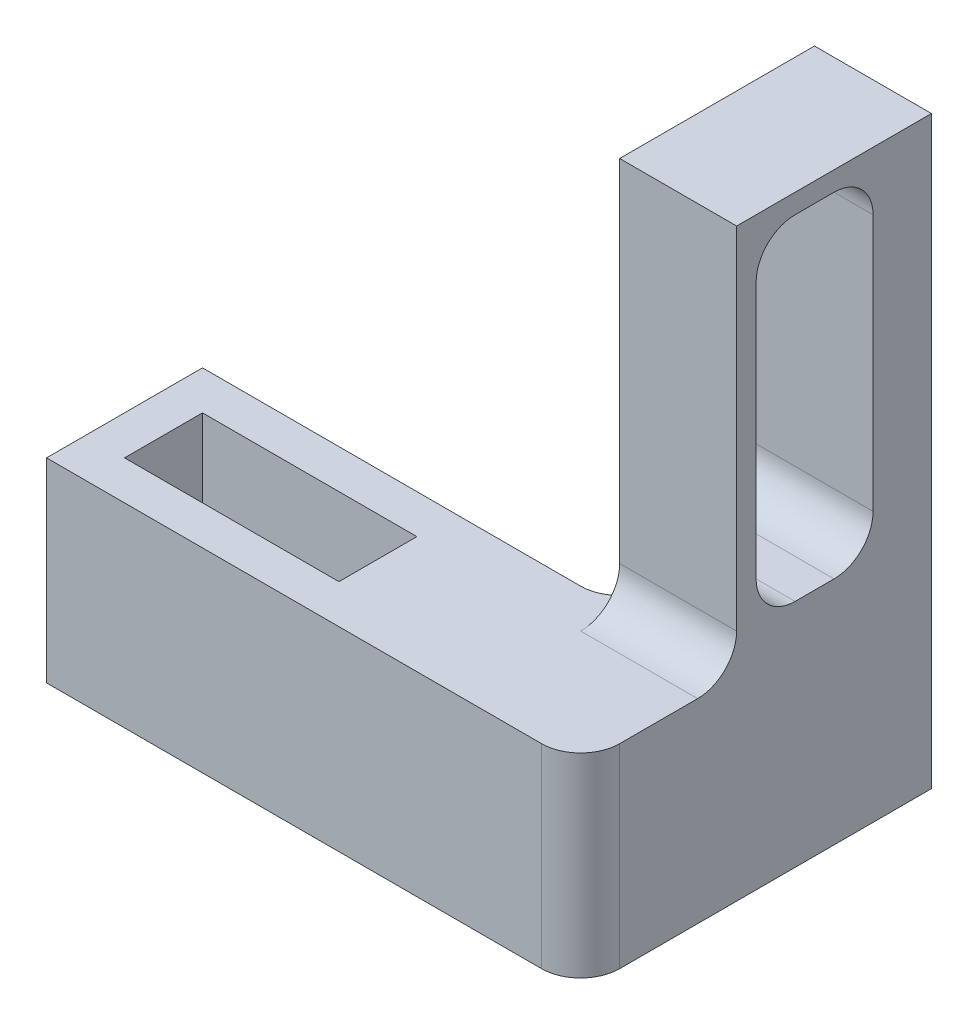
ISO-10303-21;
HEADER;
FILE_DESCRIPTION(('STEP AP214'),'2;1');
FILE_NAME('part.step','',(''),(''),'','','');
FILE_SCHEMA(('AUTOMOTIVE_DESIGN { 1 0 10303 214 1 1 1 1 }'));
ENDSEC;
DATA;
#1=APPLICATION_CONTEXT('core data for automotive mechanical design processes');
#2=APPLICATION_PROTOCOL_DEFINITION('international standard','automotive_design',2000,#1);
#3=PRODUCT_CONTEXT('',#1,'mechanical');
#4=PRODUCT('Part','Part','',(#3));
#5=PRODUCT_RELATED_PRODUCT_CATEGORY('part','',(#4));
#6=PRODUCT_DEFINITION_FORMATION('','',#4);
#7=PRODUCT_DEFINITION_CONTEXT('part definition',#1,'design');
#8=PRODUCT_DEFINITION('design','',#6,#7);
#9=PRODUCT_DEFINITION_SHAPE('','',#8);
#10=(LENGTH_UNIT() NAMED_UNIT(*) SI_UNIT(.MILLI.,.METRE.));
#11=(NAMED_UNIT(*) PLANE_ANGLE_UNIT() SI_UNIT($,.RADIAN.));
#12=(NAMED_UNIT(*) SI_UNIT($,.STERADIAN.) SOLID_ANGLE_UNIT());
#13=UNCERTAINTY_MEASURE_WITH_UNIT(LENGTH_MEASURE(1.E-05),#10,'distance_accuracy_value','');
#14=(GEOMETRIC_REPRESENTATION_CONTEXT(3) GLOBAL_UNCERTAINTY_ASSIGNED_CONTEXT((#13)) GLOBAL_UNIT_ASSIGNED_CONTEXT((#10,
#11,#12)) REPRESENTATION_CONTEXT('',''));
#15=CARTESIAN_POINT('',(0.,0.,0.));
#16=DIRECTION('',(0.,0.,1.));
#17=DIRECTION('',(1.,0.,0.));
#18=AXIS2_PLACEMENT_3D('',#15,#16,#17);
#19=CARTESIAN_POINT('',(-3.51352406652433,5.,-4.9069919410516));
#20=DIRECTION('',(0.,0.,1.));
#21=DIRECTION('',(1.,0.,0.));
#22=AXIS2_PLACEMENT_3D('',#19,#20,#21);
#23=PLANE('',#22);
#24=DIRECTION('',(0.,-1.,0.));
#25=VECTOR('',#24,1.);
#26=CARTESIAN_POINT('',(-3.51352406652433,5.,-4.9069919410516));
#27=LINE('',#26,#25);
#28=CARTESIAN_POINT('',(-3.51352406652433,5.,-4.9069919410516));
#29=VERTEX_POINT('',#28);
#30=CARTESIAN_POINT('',(-3.51352406652433,0.,-4.9069919410516));
#31=VERTEX_POINT('',#30);
#32=EDGE_CURVE('E270',#29,#31,#27,.T.);
#33=ORIENTED_EDGE('',*,*,#32,.F.);
#34=DIRECTION('',(1.,0.,0.));
#35=VECTOR('',#34,1.);
#36=CARTESIAN_POINT('',(-3.51352406652433,5.,-4.9069919410516));
#37=LINE('',#36,#35);
#38=CARTESIAN_POINT('',(6.18647593347567,5.,-4.9069919410516));
#39=VERTEX_POINT('',#38);
#40=EDGE_CURVE('E199',#29,#39,#37,.T.);
#41=ORIENTED_EDGE('',*,*,#40,.T.);
#42=DIRECTION('',(0.,1.,0.));
#43=VECTOR('',#42,1.);
#44=CARTESIAN_POINT('',(6.18647593347567,0.,-4.9069919410516));
#45=LINE('',#44,#43);
#46=CARTESIAN_POINT('',(6.18647593347567,0.,-4.9069919410516));
#47=VERTEX_POINT('',#46);
#48=EDGE_CURVE('E284',#39,#47,#45,.F.);
#49=ORIENTED_EDGE('',*,*,#48,.T.);
#50=DIRECTION('',(-1.,0.,0.));
#51=VECTOR('',#50,1.);
#52=CARTESIAN_POINT('',(-3.51352406652433,0.,-4.9069919410516));
#53=LINE('',#52,#51);
#54=EDGE_CURVE('E268',#47,#31,#53,.T.);
#55=ORIENTED_EDGE('',*,*,#54,.T.);
#56=EDGE_LOOP('',(#33,#41,#49,#55));
#57=FACE_BOUND('',#56,.T.);
#58=ADVANCED_FACE('F33',(#57),#23,.F.);
#59=CARTESIAN_POINT('',(0.,5.,0.));
#60=DIRECTION('',(0.,1.,0.));
#61=DIRECTION('',(0.,0.,1.));
#62=AXIS2_PLACEMENT_3D('',#59,#60,#61);
#63=PLANE('',#62);
#64=DIRECTION('',(1.,0.,0.));
#65=VECTOR('',#64,1.);
#66=CARTESIAN_POINT('',(-3.51352406652433,5.,-0.906991941051601));
#67=LINE('',#66,#65);
#68=CARTESIAN_POINT('',(-3.51352406652433,5.,-0.906991941051601));
#69=VERTEX_POINT('',#68);
#70=CARTESIAN_POINT('',(9.18647593347567,5.,-0.906991941051601));
#71=VERTEX_POINT('',#70);
#72=EDGE_CURVE('E267',#69,#71,#67,.T.);
#73=ORIENTED_EDGE('',*,*,#72,.T.);
#74=CARTESIAN_POINT('',(9.18647593347567,5.,-1.9069919410516));
#75=DIRECTION('',(0.,1.,0.));
#76=DIRECTION('',(0.,0.,1.));
#77=AXIS2_PLACEMENT_3D('',#74,#75,#76);
#78=CIRCLE('',#77,1.);
#79=CARTESIAN_POINT('',(10.1864759334757,5.,-1.9069919410516));
#80=VERTEX_POINT('',#79);
#81=EDGE_CURVE('E416',#71,#80,#78,.T.);
#82=ORIENTED_EDGE('',*,*,#81,.T.);
#83=DIRECTION('',(0.,0.,-1.));
#84=VECTOR('',#83,1.);
#85=CARTESIAN_POINT('',(10.1864759334757,5.,-0.906991941051601));
#86=LINE('',#85,#84);
#87=CARTESIAN_POINT('',(10.1864759334757,5.,-3.90941153273538));
#88=VERTEX_POINT('',#87);
#89=EDGE_CURVE('E214',#80,#88,#86,.T.);
#90=ORIENTED_EDGE('',*,*,#89,.T.);
#91=DIRECTION('',(1.,0.,0.));
#92=VECTOR('',#91,1.);
#93=CARTESIAN_POINT('',(0.,5.,-3.90941153273538));
#94=LINE('',#93,#92);
#95=CARTESIAN_POINT('',(7.18647593347567,5.,-3.90941153273538));
#96=VERTEX_POINT('',#95);
#97=EDGE_CURVE('E206',#88,#96,#94,.F.);
#98=ORIENTED_EDGE('',*,*,#97,.T.);
#99=DIRECTION('',(0.,0.,-1.));
#100=VECTOR('',#99,1.);
#101=CARTESIAN_POINT('',(7.18647593347567,5.,-5.9069919410516));
#102=LINE('',#101,#100);
#103=CARTESIAN_POINT('',(7.18647593347567,5.,-5.9069919410516));
#104=VERTEX_POINT('',#103);
#105=EDGE_CURVE('E187',#96,#104,#102,.T.);
#106=ORIENTED_EDGE('',*,*,#105,.T.);
#107=CARTESIAN_POINT('',(6.18647593347567,5.,-5.9069919410516));
#108=DIRECTION('',(0.,-1.,0.));
#109=DIRECTION('',(0.,0.,-1.));
#110=AXIS2_PLACEMENT_3D('',#107,#108,#109);
#111=CIRCLE('',#110,1.);
#112=EDGE_CURVE('E288',#39,#104,#111,.F.);
#113=ORIENTED_EDGE('',*,*,#112,.F.);
#114=ORIENTED_EDGE('',*,*,#40,.F.);
#115=DIRECTION('',(0.,0.,1.));
#116=VECTOR('',#115,1.);
#117=CARTESIAN_POINT('',(-3.51352406652433,5.,-4.9069919410516));
#118=LINE('',#117,#116);
#119=EDGE_CURVE('E265',#29,#69,#118,.T.);
#120=ORIENTED_EDGE('',*,*,#119,.T.);
#121=EDGE_LOOP('',(#73,#82,#90,#98,#106,#113,#114,#120));
#122=FACE_BOUND('',#121,.T.);
#123=DIRECTION('',(1.,0.,0.));
#124=VECTOR('',#123,1.);
#125=CARTESIAN_POINT('',(-2.51352406652433,5.,-1.9069919410516));
#126=LINE('',#125,#124);
#127=CARTESIAN_POINT('',(-2.51352406652433,5.,-1.9069919410516));
#128=VERTEX_POINT('',#127);
#129=CARTESIAN_POINT('',(2.98647593347567,5.,-1.9069919410516));
#130=VERTEX_POINT('',#129);
#131=EDGE_CURVE('E235',#128,#130,#126,.T.);
#132=ORIENTED_EDGE('',*,*,#131,.F.);
#133=DIRECTION('',(0.,0.,1.));
#134=VECTOR('',#133,1.);
#135=CARTESIAN_POINT('',(-2.51352406652433,5.,-3.9069919410516));
#136=LINE('',#135,#134);
#137=CARTESIAN_POINT('',(-2.51352406652433,5.,-3.9069919410516));
#138=VERTEX_POINT('',#137);
#139=EDGE_CURVE('E233',#138,#128,#136,.T.);
#140=ORIENTED_EDGE('',*,*,#139,.F.);
#141=DIRECTION('',(-1.,0.,0.));
#142=VECTOR('',#141,1.);
#143=CARTESIAN_POINT('',(-2.51352406652433,5.,-3.9069919410516));
#144=LINE('',#143,#142);
#145=CARTESIAN_POINT('',(2.98647593347567,5.,-3.9069919410516));
#146=VERTEX_POINT('',#145);
#147=EDGE_CURVE('E241',#146,#138,#144,.T.);
#148=ORIENTED_EDGE('',*,*,#147,.F.);
#149=DIRECTION('',(0.,0.,-1.));
#150=VECTOR('',#149,1.);
#151=CARTESIAN_POINT('',(2.98647593347567,5.,-3.9069919410516));
#152=LINE('',#151,#150);
#153=EDGE_CURVE('E238',#130,#146,#152,.T.);
#154=ORIENTED_EDGE('',*,*,#153,.F.);
#155=EDGE_LOOP('',(#132,#140,#148,#154));
#156=FACE_BOUND('',#155,.T.);
#157=ADVANCED_FACE('F211',(#122,#156),#63,.T.);
#158=CARTESIAN_POINT('',(0.,0.,0.));
#159=DIRECTION('',(0.,1.,0.));
#160=DIRECTION('',(0.,0.,1.));
#161=AXIS2_PLACEMENT_3D('',#158,#159,#160);
#162=PLANE('',#161);
#163=DIRECTION('',(0.,0.,-1.));
#164=VECTOR('',#163,1.);
#165=CARTESIAN_POINT('',(10.1864759334757,0.,-0.906991941051601));
#166=LINE('',#165,#164);
#167=CARTESIAN_POINT('',(10.1864759334757,0.,-1.9069919410516));
#168=VERTEX_POINT('',#167);
#169=CARTESIAN_POINT('',(10.1864759334757,0.,-9.9069919410516));
#170=VERTEX_POINT('',#169);
#171=EDGE_CURVE('E226',#168,#170,#166,.T.);
#172=ORIENTED_EDGE('',*,*,#171,.F.);
#173=CARTESIAN_POINT('',(9.18647593347567,0.,-1.9069919410516));
#174=DIRECTION('',(0.,1.,0.));
#175=DIRECTION('',(0.,0.,1.));
#176=AXIS2_PLACEMENT_3D('',#173,#174,#175);
#177=CIRCLE('',#176,1.);
#178=CARTESIAN_POINT('',(9.18647593347567,0.,-0.906991941051601));
#179=VERTEX_POINT('',#178);
#180=EDGE_CURVE('E421',#168,#179,#177,.F.);
#181=ORIENTED_EDGE('',*,*,#180,.T.);
#182=DIRECTION('',(1.,0.,0.));
#183=VECTOR('',#182,1.);
#184=CARTESIAN_POINT('',(-3.51352406652433,0.,-0.906991941051601));
#185=LINE('',#184,#183);
#186=CARTESIAN_POINT('',(-3.51352406652433,0.,-0.906991941051601));
#187=VERTEX_POINT('',#186);
#188=EDGE_CURVE('E273',#187,#179,#185,.T.);
#189=ORIENTED_EDGE('',*,*,#188,.F.);
#190=DIRECTION('',(0.,0.,1.));
#191=VECTOR('',#190,1.);
#192=CARTESIAN_POINT('',(-3.51352406652433,0.,-4.9069919410516));
#193=LINE('',#192,#191);
#194=EDGE_CURVE('E264',#31,#187,#193,.T.);
#195=ORIENTED_EDGE('',*,*,#194,.F.);
#196=ORIENTED_EDGE('',*,*,#54,.F.);
#197=CARTESIAN_POINT('',(6.18647593347567,0.,-5.9069919410516));
#198=DIRECTION('',(0.,1.,0.));
#199=DIRECTION('',(0.,0.,1.));
#200=AXIS2_PLACEMENT_3D('',#197,#198,#199);
#201=CIRCLE('',#200,1.);
#202=CARTESIAN_POINT('',(7.18647593347567,0.,-5.9069919410516));
#203=VERTEX_POINT('',#202);
#204=EDGE_CURVE('E286',#47,#203,#201,.T.);
#205=ORIENTED_EDGE('',*,*,#204,.T.);
#206=DIRECTION('',(0.,0.,1.));
#207=VECTOR('',#206,1.);
#208=CARTESIAN_POINT('',(7.18647593347567,0.,-9.9069919410516));
#209=LINE('',#208,#207);
#210=CARTESIAN_POINT('',(7.18647593347567,0.,-9.9069919410516));
#211=VERTEX_POINT('',#210);
#212=EDGE_CURVE('E227',#211,#203,#209,.T.);
#213=ORIENTED_EDGE('',*,*,#212,.F.);
#214=DIRECTION('',(-1.,0.,0.));
#215=VECTOR('',#214,1.);
#216=CARTESIAN_POINT('',(10.1864759334757,0.,-9.9069919410516));
#217=LINE('',#216,#215);
#218=EDGE_CURVE('E356',#170,#211,#217,.T.);
#219=ORIENTED_EDGE('',*,*,#218,.F.);
#220=EDGE_LOOP('',(#172,#181,#189,#195,#196,#205,#213,#219));
#221=FACE_BOUND('',#220,.T.);
#222=DIRECTION('',(0.,0.,1.));
#223=VECTOR('',#222,1.);
#224=CARTESIAN_POINT('',(-2.51352406652433,0.,-3.9069919410516));
#225=LINE('',#224,#223);
#226=CARTESIAN_POINT('',(-2.51352406652433,0.,-3.9069919410516));
#227=VERTEX_POINT('',#226);
#228=CARTESIAN_POINT('',(-2.51352406652433,0.,-1.9069919410516));
#229=VERTEX_POINT('',#228);
#230=EDGE_CURVE('E244',#227,#229,#225,.T.);
#231=ORIENTED_EDGE('',*,*,#230,.T.);
#232=DIRECTION('',(1.,0.,0.));
#233=VECTOR('',#232,1.);
#234=CARTESIAN_POINT('',(-2.51352406652433,0.,-1.9069919410516));
#235=LINE('',#234,#233);
#236=CARTESIAN_POINT('',(2.98647593347567,0.,-1.9069919410516));
#237=VERTEX_POINT('',#236);
#238=EDGE_CURVE('E247',#229,#237,#235,.T.);
#239=ORIENTED_EDGE('',*,*,#238,.T.);
#240=DIRECTION('',(0.,0.,-1.));
#241=VECTOR('',#240,1.);
#242=CARTESIAN_POINT('',(2.98647593347567,0.,-3.9069919410516));
#243=LINE('',#242,#241);
#244=CARTESIAN_POINT('',(2.98647593347567,0.,-3.9069919410516));
#245=VERTEX_POINT('',#244);
#246=EDGE_CURVE('E250',#237,#245,#243,.T.);
#247=ORIENTED_EDGE('',*,*,#246,.T.);
#248=DIRECTION('',(-1.,0.,0.));
#249=VECTOR('',#248,1.);
#250=CARTESIAN_POINT('',(-2.51352406652433,0.,-3.9069919410516));
#251=LINE('',#250,#249);
#252=EDGE_CURVE('E236',#245,#227,#251,.T.);
#253=ORIENTED_EDGE('',*,*,#252,.T.);
#254=EDGE_LOOP('',(#231,#239,#247,#253));
#255=FACE_BOUND('',#254,.T.);
#256=ADVANCED_FACE('F402',(#221,#255),#162,.F.);
#257=CARTESIAN_POINT('',(-3.51352406652433,5.,-4.9069919410516));
#258=DIRECTION('',(1.,0.,0.));
#259=DIRECTION('',(0.,0.,-1.));
#260=AXIS2_PLACEMENT_3D('',#257,#258,#259);
#261=PLANE('',#260);
#262=ORIENTED_EDGE('',*,*,#119,.F.);
#263=ORIENTED_EDGE('',*,*,#32,.T.);
#264=ORIENTED_EDGE('',*,*,#194,.T.);
#265=DIRECTION('',(0.,-1.,0.));
#266=VECTOR('',#265,1.);
#267=CARTESIAN_POINT('',(-3.51352406652433,5.,-0.906991941051601));
#268=LINE('',#267,#266);
#269=EDGE_CURVE('E364',#69,#187,#268,.T.);
#270=ORIENTED_EDGE('',*,*,#269,.F.);
#271=EDGE_LOOP('',(#262,#263,#264,#270));
#272=FACE_BOUND('',#271,.T.);
#273=ADVANCED_FACE('F409',(#272),#261,.F.);
#274=CARTESIAN_POINT('',(-3.51352406652433,5.,-0.906991941051601));
#275=DIRECTION('',(0.,0.,-1.));
#276=DIRECTION('',(-1.,0.,0.));
#277=AXIS2_PLACEMENT_3D('',#274,#275,#276);
#278=PLANE('',#277);
#279=ORIENTED_EDGE('',*,*,#188,.T.);
#280=DIRECTION('',(0.,-1.,0.));
#281=VECTOR('',#280,1.);
#282=CARTESIAN_POINT('',(9.18647593347567,5.,-0.906991941051601));
#283=LINE('',#282,#281);
#284=EDGE_CURVE('E414',#179,#71,#283,.F.);
#285=ORIENTED_EDGE('',*,*,#284,.T.);
#286=ORIENTED_EDGE('',*,*,#72,.F.);
#287=ORIENTED_EDGE('',*,*,#269,.T.);
#288=EDGE_LOOP('',(#279,#285,#286,#287));
#289=FACE_BOUND('',#288,.T.);
#290=ADVANCED_FACE('F412',(#289),#278,.F.);
#291=CARTESIAN_POINT('',(-2.51352406652433,5.,-3.9069919410516));
#292=DIRECTION('',(1.,0.,0.));
#293=DIRECTION('',(0.,0.,-1.));
#294=AXIS2_PLACEMENT_3D('',#291,#292,#293);
#295=PLANE('',#294);
#296=ORIENTED_EDGE('',*,*,#230,.F.);
#297=DIRECTION('',(0.,-1.,0.));
#298=VECTOR('',#297,1.);
#299=CARTESIAN_POINT('',(-2.51352406652433,5.,-3.9069919410516));
#300=LINE('',#299,#298);
#301=EDGE_CURVE('E243',#138,#227,#300,.T.);
#302=ORIENTED_EDGE('',*,*,#301,.F.);
#303=ORIENTED_EDGE('',*,*,#139,.T.);
#304=DIRECTION('',(0.,-1.,0.));
#305=VECTOR('',#304,1.);
#306=CARTESIAN_POINT('',(-2.51352406652433,5.,-1.9069919410516));
#307=LINE('',#306,#305);
#308=EDGE_CURVE('E261',#128,#229,#307,.T.);
#309=ORIENTED_EDGE('',*,*,#308,.T.);
#310=EDGE_LOOP('',(#296,#302,#303,#309));
#311=FACE_BOUND('',#310,.T.);
#312=ADVANCED_FACE('F450',(#311),#295,.T.);
#313=CARTESIAN_POINT('',(-2.51352406652433,5.,-1.9069919410516));
#314=DIRECTION('',(0.,0.,-1.));
#315=DIRECTION('',(-1.,0.,0.));
#316=AXIS2_PLACEMENT_3D('',#313,#314,#315);
#317=PLANE('',#316);
#318=ORIENTED_EDGE('',*,*,#238,.F.);
#319=ORIENTED_EDGE('',*,*,#308,.F.);
#320=ORIENTED_EDGE('',*,*,#131,.T.);
#321=DIRECTION('',(0.,-1.,0.));
#322=VECTOR('',#321,1.);
#323=CARTESIAN_POINT('',(2.98647593347567,5.,-1.9069919410516));
#324=LINE('',#323,#322);
#325=EDGE_CURVE('E259',#130,#237,#324,.T.);
#326=ORIENTED_EDGE('',*,*,#325,.T.);
#327=EDGE_LOOP('',(#318,#319,#320,#326));
#328=FACE_BOUND('',#327,.T.);
#329=ADVANCED_FACE('F633',(#328),#317,.T.);
#330=CARTESIAN_POINT('',(2.98647593347567,5.,-3.9069919410516));
#331=DIRECTION('',(-1.,0.,0.));
#332=DIRECTION('',(0.,0.,1.));
#333=AXIS2_PLACEMENT_3D('',#330,#331,#332);
#334=PLANE('',#333);
#335=ORIENTED_EDGE('',*,*,#246,.F.);
#336=ORIENTED_EDGE('',*,*,#325,.F.);
#337=ORIENTED_EDGE('',*,*,#153,.T.);
#338=DIRECTION('',(0.,-1.,0.));
#339=VECTOR('',#338,1.);
#340=CARTESIAN_POINT('',(2.98647593347567,5.,-3.9069919410516));
#341=LINE('',#340,#339);
#342=EDGE_CURVE('E257',#146,#245,#341,.T.);
#343=ORIENTED_EDGE('',*,*,#342,.T.);
#344=EDGE_LOOP('',(#335,#336,#337,#343));
#345=FACE_BOUND('',#344,.T.);
#346=ADVANCED_FACE('F622',(#345),#334,.T.);
#347=CARTESIAN_POINT('',(-2.51352406652433,5.,-3.9069919410516));
#348=DIRECTION('',(0.,0.,1.));
#349=DIRECTION('',(1.,0.,0.));
#350=AXIS2_PLACEMENT_3D('',#347,#348,#349);
#351=PLANE('',#350);
#352=ORIENTED_EDGE('',*,*,#252,.F.);
#353=ORIENTED_EDGE('',*,*,#342,.F.);
#354=ORIENTED_EDGE('',*,*,#147,.T.);
#355=ORIENTED_EDGE('',*,*,#301,.T.);
#356=EDGE_LOOP('',(#352,#353,#354,#355));
#357=FACE_BOUND('',#356,.T.);
#358=ADVANCED_FACE('F514',(#357),#351,.T.);
#359=CARTESIAN_POINT('',(10.1864759334757,5.,-0.906991941051601));
#360=DIRECTION('',(1.,0.,0.));
#361=DIRECTION('',(0.,0.,-1.));
#362=AXIS2_PLACEMENT_3D('',#359,#360,#361);
#363=PLANE('',#362);
#364=DIRECTION('',(0.,-1.,0.));
#365=VECTOR('',#364,1.);
#366=CARTESIAN_POINT('',(10.1864759334757,14.5,-5.40941153273538));
#367=LINE('',#366,#365);
#368=CARTESIAN_POINT('',(10.1864759334757,13.5,-5.40941153273538));
#369=VERTEX_POINT('',#368);
#370=CARTESIAN_POINT('',(10.1864759334757,6.91005895147456,-5.40941153273538));
#371=VERTEX_POINT('',#370);
#372=EDGE_CURVE('E383',#369,#371,#367,.T.);
#373=ORIENTED_EDGE('',*,*,#372,.F.);
#374=CARTESIAN_POINT('',(10.1864759334757,13.5,-6.40941153273538));
#375=DIRECTION('',(1.,0.,0.));
#376=DIRECTION('',(0.,0.,-1.));
#377=AXIS2_PLACEMENT_3D('',#374,#375,#376);
#378=CIRCLE('',#377,1.);
#379=CARTESIAN_POINT('',(10.1864759334757,14.5,-6.40941153273538));
#380=VERTEX_POINT('',#379);
#381=EDGE_CURVE('E317',#369,#380,#378,.F.);
#382=ORIENTED_EDGE('',*,*,#381,.T.);
#383=DIRECTION('',(0.,0.,1.));
#384=VECTOR('',#383,1.);
#385=CARTESIAN_POINT('',(10.1864759334757,14.5,-5.40941153273538));
#386=LINE('',#385,#384);
#387=CARTESIAN_POINT('',(10.1864759334757,14.5,-7.40941153273538));
#388=VERTEX_POINT('',#387);
#389=EDGE_CURVE('E329',#388,#380,#386,.T.);
#390=ORIENTED_EDGE('',*,*,#389,.F.);
#391=CARTESIAN_POINT('',(10.1864759334757,13.5,-7.40941153273538));
#392=DIRECTION('',(1.,0.,0.));
#393=DIRECTION('',(0.,0.,-1.));
#394=AXIS2_PLACEMENT_3D('',#391,#392,#393);
#395=CIRCLE('',#394,1.);
#396=CARTESIAN_POINT('',(10.1864759334757,13.5,-8.40941153273538));
#397=VERTEX_POINT('',#396);
#398=EDGE_CURVE('E41',#388,#397,#395,.F.);
#399=ORIENTED_EDGE('',*,*,#398,.T.);
#400=DIRECTION('',(0.,1.,0.));
#401=VECTOR('',#400,1.);
#402=CARTESIAN_POINT('',(10.1864759334757,14.5,-8.40941153273538));
#403=LINE('',#402,#401);
#404=CARTESIAN_POINT('',(10.1864759334757,6.91005895147456,-8.40941153273538));
#405=VERTEX_POINT('',#404);
#406=EDGE_CURVE('E337',#405,#397,#403,.T.);
#407=ORIENTED_EDGE('',*,*,#406,.F.);
#408=CARTESIAN_POINT('',(10.1864759334757,6.91005895147456,-7.40941153273538));
#409=DIRECTION('',(1.,0.,0.));
#410=DIRECTION('',(0.,0.,-1.));
#411=AXIS2_PLACEMENT_3D('',#408,#409,#410);
#412=CIRCLE('',#411,1.);
#413=CARTESIAN_POINT('',(10.1864759334757,5.91005895147456,-7.40941153273538));
#414=VERTEX_POINT('',#413);
#415=EDGE_CURVE('E296',#405,#414,#412,.F.);
#416=ORIENTED_EDGE('',*,*,#415,.T.);
#417=DIRECTION('',(0.,0.,-1.));
#418=VECTOR('',#417,1.);
#419=CARTESIAN_POINT('',(10.1864759334757,5.91005895147456,-5.40941153273538));
#420=LINE('',#419,#418);
#421=CARTESIAN_POINT('',(10.1864759334757,5.91005895147456,-6.40941153273538));
#422=VERTEX_POINT('',#421);
#423=EDGE_CURVE('E341',#422,#414,#420,.T.);
#424=ORIENTED_EDGE('',*,*,#423,.F.);
#425=CARTESIAN_POINT('',(10.1864759334757,6.91005895147456,-6.40941153273538));
#426=DIRECTION('',(1.,0.,0.));
#427=DIRECTION('',(0.,0.,-1.));
#428=AXIS2_PLACEMENT_3D('',#425,#426,#427);
#429=CIRCLE('',#428,1.);
#430=EDGE_CURVE('E306',#422,#371,#429,.F.);
#431=ORIENTED_EDGE('',*,*,#430,.T.);
#432=EDGE_LOOP('',(#373,#382,#390,#399,#407,#416,#424,#431));
#433=FACE_BOUND('',#432,.T.);
#434=ORIENTED_EDGE('',*,*,#89,.F.);
#435=DIRECTION('',(0.,-1.,0.));
#436=VECTOR('',#435,1.);
#437=CARTESIAN_POINT('',(10.1864759334757,0.,-1.9069919410516));
#438=LINE('',#437,#436);
#439=EDGE_CURVE('E218',#80,#168,#438,.T.);
#440=ORIENTED_EDGE('',*,*,#439,.T.);
#441=ORIENTED_EDGE('',*,*,#171,.T.);
#442=DIRECTION('',(0.,-1.,0.));
#443=VECTOR('',#442,1.);
#444=CARTESIAN_POINT('',(10.1864759334757,5.,-9.9069919410516));
#445=LINE('',#444,#443);
#446=CARTESIAN_POINT('',(10.1864759334757,15.,-9.9069919410516));
#447=VERTEX_POINT('',#446);
#448=EDGE_CURVE('E353',#447,#170,#445,.T.);
#449=ORIENTED_EDGE('',*,*,#448,.F.);
#450=DIRECTION('',(0.,0.,-1.));
#451=VECTOR('',#450,1.);
#452=CARTESIAN_POINT('',(10.1864759334757,15.,-9.9069919410516));
#453=LINE('',#452,#451);
#454=CARTESIAN_POINT('',(10.1864759334757,15.,-4.90941153273538));
#455=VERTEX_POINT('',#454);
#456=EDGE_CURVE('E346',#455,#447,#453,.T.);
#457=ORIENTED_EDGE('',*,*,#456,.F.);
#458=DIRECTION('',(0.,-1.,0.));
#459=VECTOR('',#458,1.);
#460=CARTESIAN_POINT('',(10.1864759334757,15.,-4.90941153273538));
#461=LINE('',#460,#459);
#462=CARTESIAN_POINT('',(10.1864759334757,6.,-4.90941153273538));
#463=VERTEX_POINT('',#462);
#464=EDGE_CURVE('E352',#455,#463,#461,.T.);
#465=ORIENTED_EDGE('',*,*,#464,.T.);
#466=CARTESIAN_POINT('',(10.1864759334757,6.,-3.90941153273538));
#467=DIRECTION('',(1.,0.,0.));
#468=DIRECTION('',(0.,0.,-1.));
#469=AXIS2_PLACEMENT_3D('',#466,#467,#468);
#470=CIRCLE('',#469,1.);
#471=EDGE_CURVE('E216',#463,#88,#470,.F.);
#472=ORIENTED_EDGE('',*,*,#471,.T.);
#473=EDGE_LOOP('',(#434,#440,#441,#449,#457,#465,#472));
#474=FACE_BOUND('',#473,.T.);
#475=ADVANCED_FACE('F333',(#433,#474),#363,.T.);
#476=CARTESIAN_POINT('',(7.18647593347567,5.,-9.9069919410516));
#477=DIRECTION('',(1.,0.,0.));
#478=DIRECTION('',(0.,1.,0.));
#479=AXIS2_PLACEMENT_3D('',#476,#477,#478);
#480=PLANE('',#479);
#481=DIRECTION('',(0.,1.,0.));
#482=VECTOR('',#481,1.);
#483=CARTESIAN_POINT('',(7.18647593347567,14.5,-5.40941153273538));
#484=LINE('',#483,#482);
#485=CARTESIAN_POINT('',(7.18647593347567,6.91005895147456,-5.40941153273538));
#486=VERTEX_POINT('',#485);
#487=CARTESIAN_POINT('',(7.18647593347567,13.5,-5.40941153273538));
#488=VERTEX_POINT('',#487);
#489=EDGE_CURVE('E384',#486,#488,#484,.T.);
#490=ORIENTED_EDGE('',*,*,#489,.F.);
#491=CARTESIAN_POINT('',(7.18647593347567,6.91005895147456,-6.40941153273538));
#492=DIRECTION('',(1.,0.,0.));
#493=DIRECTION('',(0.,1.,0.));
#494=AXIS2_PLACEMENT_3D('',#491,#492,#493);
#495=CIRCLE('',#494,1.);
#496=CARTESIAN_POINT('',(7.18647593347567,5.91005895147456,-6.40941153273538));
#497=VERTEX_POINT('',#496);
#498=EDGE_CURVE('E309',#486,#497,#495,.T.);
#499=ORIENTED_EDGE('',*,*,#498,.T.);
#500=DIRECTION('',(0.,0.,-1.));
#501=VECTOR('',#500,1.);
#502=CARTESIAN_POINT('',(7.18647593347567,5.91005895147456,-9.9069919410516));
#503=LINE('',#502,#501);
#504=CARTESIAN_POINT('',(7.18647593347567,5.91005895147456,-7.40941153273538));
#505=VERTEX_POINT('',#504);
#506=EDGE_CURVE('E371',#497,#505,#503,.T.);
#507=ORIENTED_EDGE('',*,*,#506,.T.);
#508=CARTESIAN_POINT('',(7.18647593347567,6.91005895147456,-7.40941153273538));
#509=DIRECTION('',(1.,0.,0.));
#510=DIRECTION('',(0.,1.,0.));
#511=AXIS2_PLACEMENT_3D('',#508,#509,#510);
#512=CIRCLE('',#511,1.);
#513=CARTESIAN_POINT('',(7.18647593347567,6.91005895147456,-8.40941153273538));
#514=VERTEX_POINT('',#513);
#515=EDGE_CURVE('E299',#505,#514,#512,.T.);
#516=ORIENTED_EDGE('',*,*,#515,.T.);
#517=DIRECTION('',(0.,1.,0.));
#518=VECTOR('',#517,1.);
#519=CARTESIAN_POINT('',(7.18647593347567,5.,-8.40941153273538));
#520=LINE('',#519,#518);
#521=CARTESIAN_POINT('',(7.18647593347567,13.5,-8.40941153273538));
#522=VERTEX_POINT('',#521);
#523=EDGE_CURVE('E373',#514,#522,#520,.T.);
#524=ORIENTED_EDGE('',*,*,#523,.T.);
#525=CARTESIAN_POINT('',(7.18647593347567,13.5,-7.40941153273538));
#526=DIRECTION('',(1.,0.,0.));
#527=DIRECTION('',(0.,1.,0.));
#528=AXIS2_PLACEMENT_3D('',#525,#526,#527);
#529=CIRCLE('',#528,1.);
#530=CARTESIAN_POINT('',(7.18647593347567,14.5,-7.40941153273538));
#531=VERTEX_POINT('',#530);
#532=EDGE_CURVE('E11',#522,#531,#529,.T.);
#533=ORIENTED_EDGE('',*,*,#532,.T.);
#534=DIRECTION('',(0.,0.,1.));
#535=VECTOR('',#534,1.);
#536=CARTESIAN_POINT('',(7.18647593347567,14.5,-9.9069919410516));
#537=LINE('',#536,#535);
#538=CARTESIAN_POINT('',(7.18647593347567,14.5,-6.40941153273538));
#539=VERTEX_POINT('',#538);
#540=EDGE_CURVE('E220',#531,#539,#537,.T.);
#541=ORIENTED_EDGE('',*,*,#540,.T.);
#542=CARTESIAN_POINT('',(7.18647593347567,13.5,-6.40941153273538));
#543=DIRECTION('',(1.,0.,0.));
#544=DIRECTION('',(0.,1.,0.));
#545=AXIS2_PLACEMENT_3D('',#542,#543,#544);
#546=CIRCLE('',#545,1.);
#547=EDGE_CURVE('E320',#539,#488,#546,.T.);
#548=ORIENTED_EDGE('',*,*,#547,.T.);
#549=EDGE_LOOP('',(#490,#499,#507,#516,#524,#533,#541,#548));
#550=FACE_BOUND('',#549,.T.);
#551=ORIENTED_EDGE('',*,*,#212,.T.);
#552=DIRECTION('',(0.,1.,0.));
#553=VECTOR('',#552,1.);
#554=CARTESIAN_POINT('',(7.18647593347567,5.93047785285145,-5.9069919410516));
#555=LINE('',#554,#553);
#556=EDGE_CURVE('E195',#203,#104,#555,.T.);
#557=ORIENTED_EDGE('',*,*,#556,.T.);
#558=ORIENTED_EDGE('',*,*,#105,.F.);
#559=CARTESIAN_POINT('',(7.18647593347567,6.,-3.90941153273538));
#560=DIRECTION('',(1.,0.,0.));
#561=DIRECTION('',(0.,0.,-1.));
#562=AXIS2_PLACEMENT_3D('',#559,#560,#561);
#563=CIRCLE('',#562,1.);
#564=CARTESIAN_POINT('',(7.18647593347567,6.,-4.90941153273538));
#565=VERTEX_POINT('',#564);
#566=EDGE_CURVE('E192',#565,#96,#563,.F.);
#567=ORIENTED_EDGE('',*,*,#566,.F.);
#568=DIRECTION('',(0.,-1.,0.));
#569=VECTOR('',#568,1.);
#570=CARTESIAN_POINT('',(7.18647593347567,15.,-4.90941153273538));
#571=LINE('',#570,#569);
#572=CARTESIAN_POINT('',(7.18647593347567,15.,-4.90941153273538));
#573=VERTEX_POINT('',#572);
#574=EDGE_CURVE('E208',#573,#565,#571,.T.);
#575=ORIENTED_EDGE('',*,*,#574,.F.);
#576=DIRECTION('',(0.,0.,1.));
#577=VECTOR('',#576,1.);
#578=CARTESIAN_POINT('',(7.18647593347567,15.,-9.9069919410516));
#579=LINE('',#578,#577);
#580=CARTESIAN_POINT('',(7.18647593347567,15.,-9.9069919410516));
#581=VERTEX_POINT('',#580);
#582=EDGE_CURVE('E336',#581,#573,#579,.T.);
#583=ORIENTED_EDGE('',*,*,#582,.F.);
#584=DIRECTION('',(0.,1.,0.));
#585=VECTOR('',#584,1.);
#586=CARTESIAN_POINT('',(7.18647593347567,5.,-9.9069919410516));
#587=LINE('',#586,#585);
#588=EDGE_CURVE('E357',#211,#581,#587,.T.);
#589=ORIENTED_EDGE('',*,*,#588,.F.);
#590=EDGE_LOOP('',(#551,#557,#558,#567,#575,#583,#589));
#591=FACE_BOUND('',#590,.T.);
#592=ADVANCED_FACE('F190',(#550,#591),#480,.F.);
#593=CARTESIAN_POINT('',(0.,0.,-9.9069919410516));
#594=DIRECTION('',(0.,0.,-1.));
#595=DIRECTION('',(-1.,0.,0.));
#596=AXIS2_PLACEMENT_3D('',#593,#594,#595);
#597=PLANE('',#596);
#598=ORIENTED_EDGE('',*,*,#448,.T.);
#599=ORIENTED_EDGE('',*,*,#218,.T.);
#600=ORIENTED_EDGE('',*,*,#588,.T.);
#601=DIRECTION('',(-1.,0.,0.));
#602=VECTOR('',#601,1.);
#603=CARTESIAN_POINT('',(7.18647593347567,15.,-9.9069919410516));
#604=LINE('',#603,#602);
#605=EDGE_CURVE('E349',#447,#581,#604,.T.);
#606=ORIENTED_EDGE('',*,*,#605,.F.);
#607=EDGE_LOOP('',(#598,#599,#600,#606));
#608=FACE_BOUND('',#607,.T.);
#609=ADVANCED_FACE('F423',(#608),#597,.T.);
#610=CARTESIAN_POINT('',(7.18647593347567,15.,-4.90941153273538));
#611=DIRECTION('',(0.,0.,-1.));
#612=DIRECTION('',(-1.,0.,0.));
#613=AXIS2_PLACEMENT_3D('',#610,#611,#612);
#614=PLANE('',#613);
#615=DIRECTION('',(1.,0.,0.));
#616=VECTOR('',#615,1.);
#617=CARTESIAN_POINT('',(7.18647593347567,15.,-4.90941153273538));
#618=LINE('',#617,#616);
#619=EDGE_CURVE('E339',#573,#455,#618,.T.);
#620=ORIENTED_EDGE('',*,*,#619,.F.);
#621=ORIENTED_EDGE('',*,*,#574,.T.);
#622=DIRECTION('',(1.,0.,0.));
#623=VECTOR('',#622,1.);
#624=CARTESIAN_POINT('',(7.18647593347567,6.,-4.90941153273538));
#625=LINE('',#624,#623);
#626=EDGE_CURVE('E207',#565,#463,#625,.T.);
#627=ORIENTED_EDGE('',*,*,#626,.T.);
#628=ORIENTED_EDGE('',*,*,#464,.F.);
#629=EDGE_LOOP('',(#620,#621,#627,#628));
#630=FACE_BOUND('',#629,.T.);
#631=ADVANCED_FACE('F431',(#630),#614,.F.);
#632=CARTESIAN_POINT('',(0.,15.,0.));
#633=DIRECTION('',(0.,1.,0.));
#634=DIRECTION('',(0.,0.,1.));
#635=AXIS2_PLACEMENT_3D('',#632,#633,#634);
#636=PLANE('',#635);
#637=ORIENTED_EDGE('',*,*,#582,.T.);
#638=ORIENTED_EDGE('',*,*,#619,.T.);
#639=ORIENTED_EDGE('',*,*,#456,.T.);
#640=ORIENTED_EDGE('',*,*,#605,.T.);
#641=EDGE_LOOP('',(#637,#638,#639,#640));
#642=FACE_BOUND('',#641,.T.);
#643=ADVANCED_FACE('F426',(#642),#636,.T.);
#644=CARTESIAN_POINT('',(0.186475933475672,14.5,-5.40941153273538));
#645=DIRECTION('',(0.,0.,1.));
#646=DIRECTION('',(0.,-1.,0.));
#647=AXIS2_PLACEMENT_3D('',#644,#645,#646);
#648=PLANE('',#647);
#649=ORIENTED_EDGE('',*,*,#489,.T.);
#650=DIRECTION('',(1.,0.,0.));
#651=VECTOR('',#650,1.);
#652=CARTESIAN_POINT('',(10.1864759334757,13.5,-5.40941153273538));
#653=LINE('',#652,#651);
#654=EDGE_CURVE('E311',#488,#369,#653,.T.);
#655=ORIENTED_EDGE('',*,*,#654,.T.);
#656=ORIENTED_EDGE('',*,*,#372,.T.);
#657=DIRECTION('',(1.,0.,0.));
#658=VECTOR('',#657,1.);
#659=CARTESIAN_POINT('',(7.18647593347567,6.91005895147456,-5.40941153273538));
#660=LINE('',#659,#658);
#661=EDGE_CURVE('E304',#371,#486,#660,.F.);
#662=ORIENTED_EDGE('',*,*,#661,.T.);
#663=EDGE_LOOP('',(#649,#655,#656,#662));
#664=FACE_BOUND('',#663,.T.);
#665=ADVANCED_FACE('F382',(#664),#648,.F.);
#666=CARTESIAN_POINT('',(0.186475933475672,14.5,-5.40941153273538));
#667=DIRECTION('',(0.,1.,0.));
#668=DIRECTION('',(0.,0.,1.));
#669=AXIS2_PLACEMENT_3D('',#666,#667,#668);
#670=PLANE('',#669);
#671=ORIENTED_EDGE('',*,*,#540,.F.);
#672=DIRECTION('',(1.,0.,0.));
#673=VECTOR('',#672,1.);
#674=CARTESIAN_POINT('',(10.1864759334757,14.5,-7.40941153273538));
#675=LINE('',#674,#673);
#676=EDGE_CURVE('E322',#531,#388,#675,.T.);
#677=ORIENTED_EDGE('',*,*,#676,.T.);
#678=ORIENTED_EDGE('',*,*,#389,.T.);
#679=DIRECTION('',(1.,0.,0.));
#680=VECTOR('',#679,1.);
#681=CARTESIAN_POINT('',(7.18647593347567,14.5,-6.40941153273538));
#682=LINE('',#681,#680);
#683=EDGE_CURVE('E314',#380,#539,#682,.F.);
#684=ORIENTED_EDGE('',*,*,#683,.T.);
#685=EDGE_LOOP('',(#671,#677,#678,#684));
#686=FACE_BOUND('',#685,.T.);
#687=ADVANCED_FACE('F328',(#686),#670,.F.);
#688=CARTESIAN_POINT('',(0.186475933475672,14.5,-8.40941153273538));
#689=DIRECTION('',(0.,0.,-1.));
#690=DIRECTION('',(-1.,0.,0.));
#691=AXIS2_PLACEMENT_3D('',#688,#689,#690);
#692=PLANE('',#691);
#693=ORIENTED_EDGE('',*,*,#406,.T.);
#694=DIRECTION('',(1.,0.,0.));
#695=VECTOR('',#694,1.);
#696=CARTESIAN_POINT('',(7.18647593347567,13.5,-8.40941153273538));
#697=LINE('',#696,#695);
#698=EDGE_CURVE('E54',#397,#522,#697,.F.);
#699=ORIENTED_EDGE('',*,*,#698,.T.);
#700=ORIENTED_EDGE('',*,*,#523,.F.);
#701=DIRECTION('',(1.,0.,0.));
#702=VECTOR('',#701,1.);
#703=CARTESIAN_POINT('',(10.1864759334757,6.91005895147456,-8.40941153273538));
#704=LINE('',#703,#702);
#705=EDGE_CURVE('E290',#514,#405,#704,.T.);
#706=ORIENTED_EDGE('',*,*,#705,.T.);
#707=EDGE_LOOP('',(#693,#699,#700,#706));
#708=FACE_BOUND('',#707,.T.);
#709=ADVANCED_FACE('F479',(#708),#692,.F.);
#710=CARTESIAN_POINT('',(0.186475933475672,5.91005895147456,-5.40941153273538));
#711=DIRECTION('',(0.,-1.,0.));
#712=DIRECTION('',(0.,0.,-1.));
#713=AXIS2_PLACEMENT_3D('',#710,#711,#712);
#714=PLANE('',#713);
#715=ORIENTED_EDGE('',*,*,#506,.F.);
#716=DIRECTION('',(1.,0.,0.));
#717=VECTOR('',#716,1.);
#718=CARTESIAN_POINT('',(10.1864759334757,5.91005895147456,-6.40941153273538));
#719=LINE('',#718,#717);
#720=EDGE_CURVE('E301',#497,#422,#719,.T.);
#721=ORIENTED_EDGE('',*,*,#720,.T.);
#722=ORIENTED_EDGE('',*,*,#423,.T.);
#723=DIRECTION('',(1.,0.,0.));
#724=VECTOR('',#723,1.);
#725=CARTESIAN_POINT('',(7.18647593347567,5.91005895147456,-7.40941153273538));
#726=LINE('',#725,#724);
#727=EDGE_CURVE('E293',#414,#505,#726,.F.);
#728=ORIENTED_EDGE('',*,*,#727,.T.);
#729=EDGE_LOOP('',(#715,#721,#722,#728));
#730=FACE_BOUND('',#729,.T.);
#731=ADVANCED_FACE('F455',(#730),#714,.F.);
#732=CARTESIAN_POINT('',(7.18647593347567,6.,-3.90941153273538));
#733=DIRECTION('',(1.,0.,0.));
#734=DIRECTION('',(0.,0.,-1.));
#735=AXIS2_PLACEMENT_3D('',#732,#733,#734);
#736=CYLINDRICAL_SURFACE('',#735,1.);
#737=ORIENTED_EDGE('',*,*,#626,.F.);
#738=ORIENTED_EDGE('',*,*,#566,.T.);
#739=ORIENTED_EDGE('',*,*,#97,.F.);
#740=ORIENTED_EDGE('',*,*,#471,.F.);
#741=EDGE_LOOP('',(#737,#738,#739,#740));
#742=FACE_BOUND('',#741,.T.);
#743=ADVANCED_FACE('F204',(#742),#736,.F.);
#744=CARTESIAN_POINT('',(9.18647593347567,5.,-1.9069919410516));
#745=DIRECTION('',(0.,1.,0.));
#746=DIRECTION('',(0.,0.,1.));
#747=AXIS2_PLACEMENT_3D('',#744,#745,#746);
#748=CYLINDRICAL_SURFACE('',#747,1.);
#749=ORIENTED_EDGE('',*,*,#81,.F.);
#750=ORIENTED_EDGE('',*,*,#284,.F.);
#751=ORIENTED_EDGE('',*,*,#180,.F.);
#752=ORIENTED_EDGE('',*,*,#439,.F.);
#753=EDGE_LOOP('',(#749,#750,#751,#752));
#754=FACE_BOUND('',#753,.T.);
#755=ADVANCED_FACE('F419',(#754),#748,.T.);
#756=CARTESIAN_POINT('',(6.18647593347567,5.,-5.9069919410516));
#757=DIRECTION('',(0.,-1.,0.));
#758=DIRECTION('',(1.,0.,0.));
#759=AXIS2_PLACEMENT_3D('',#756,#757,#758);
#760=CYLINDRICAL_SURFACE('',#759,1.);
#761=ORIENTED_EDGE('',*,*,#48,.F.);
#762=ORIENTED_EDGE('',*,*,#112,.T.);
#763=ORIENTED_EDGE('',*,*,#556,.F.);
#764=ORIENTED_EDGE('',*,*,#204,.F.);
#765=EDGE_LOOP('',(#761,#762,#763,#764));
#766=FACE_BOUND('',#765,.T.);
#767=ADVANCED_FACE('F399',(#766),#760,.F.);
#768=CARTESIAN_POINT('',(0.186475933475672,6.91005895147456,-7.40941153273538));
#769=DIRECTION('',(-1.,0.,0.));
#770=DIRECTION('',(0.,0.,1.));
#771=AXIS2_PLACEMENT_3D('',#768,#769,#770);
#772=CYLINDRICAL_SURFACE('',#771,1.);
#773=ORIENTED_EDGE('',*,*,#515,.F.);
#774=ORIENTED_EDGE('',*,*,#727,.F.);
#775=ORIENTED_EDGE('',*,*,#415,.F.);
#776=ORIENTED_EDGE('',*,*,#705,.F.);
#777=EDGE_LOOP('',(#773,#774,#775,#776));
#778=FACE_BOUND('',#777,.T.);
#779=ADVANCED_FACE('F460',(#778),#772,.F.);
#780=CARTESIAN_POINT('',(0.186475933475672,6.91005895147456,-6.40941153273538));
#781=DIRECTION('',(-1.,0.,0.));
#782=DIRECTION('',(0.,0.,1.));
#783=AXIS2_PLACEMENT_3D('',#780,#781,#782);
#784=CYLINDRICAL_SURFACE('',#783,1.);
#785=ORIENTED_EDGE('',*,*,#498,.F.);
#786=ORIENTED_EDGE('',*,*,#661,.F.);
#787=ORIENTED_EDGE('',*,*,#430,.F.);
#788=ORIENTED_EDGE('',*,*,#720,.F.);
#789=EDGE_LOOP('',(#785,#786,#787,#788));
#790=FACE_BOUND('',#789,.T.);
#791=ADVANCED_FACE('F463',(#790),#784,.F.);
#792=CARTESIAN_POINT('',(0.186475933475672,13.5,-6.40941153273538));
#793=DIRECTION('',(-1.,0.,0.));
#794=DIRECTION('',(0.,0.,1.));
#795=AXIS2_PLACEMENT_3D('',#792,#793,#794);
#796=CYLINDRICAL_SURFACE('',#795,1.);
#797=ORIENTED_EDGE('',*,*,#547,.F.);
#798=ORIENTED_EDGE('',*,*,#683,.F.);
#799=ORIENTED_EDGE('',*,*,#381,.F.);
#800=ORIENTED_EDGE('',*,*,#654,.F.);
#801=EDGE_LOOP('',(#797,#798,#799,#800));
#802=FACE_BOUND('',#801,.T.);
#803=ADVANCED_FACE('F380',(#802),#796,.F.);
#804=CARTESIAN_POINT('',(0.186475933475672,13.5,-7.40941153273538));
#805=DIRECTION('',(-1.,0.,0.));
#806=DIRECTION('',(0.,0.,1.));
#807=AXIS2_PLACEMENT_3D('',#804,#805,#806);
#808=CYLINDRICAL_SURFACE('',#807,1.);
#809=ORIENTED_EDGE('',*,*,#532,.F.);
#810=ORIENTED_EDGE('',*,*,#698,.F.);
#811=ORIENTED_EDGE('',*,*,#398,.F.);
#812=ORIENTED_EDGE('',*,*,#676,.F.);
#813=EDGE_LOOP('',(#809,#810,#811,#812));
#814=FACE_BOUND('',#813,.T.);
#815=ADVANCED_FACE('F35',(#814),#808,.F.);
#816=CLOSED_SHELL('',(#58,#157,#256,#273,#290,#312,#329,#346,#358,#475,#592,#609,#631,#643,#665,
#687,#709,#731,#743,#755,#767,#779,#791,#803,#815));
#817=MANIFOLD_SOLID_BREP('B2',#816);
#818=ADVANCED_BREP_SHAPE_REPRESENTATION('',(#18,#817),#14);
#819=SHAPE_DEFINITION_REPRESENTATION(#9,#818);
ENDSEC;
END-ISO-10303-21;
